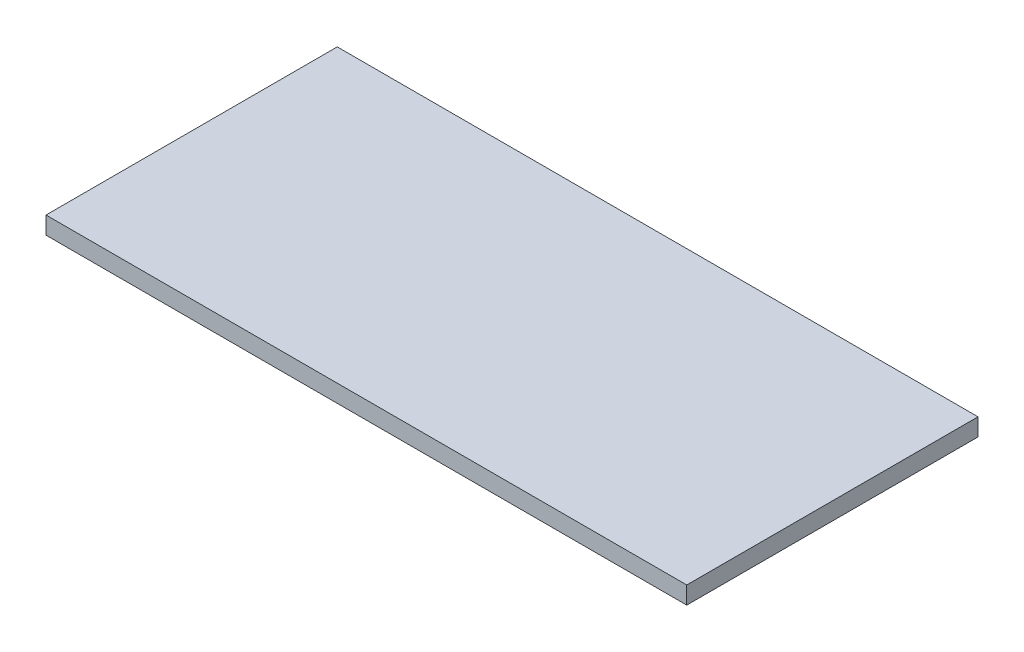
ISO-10303-21;
HEADER;
FILE_DESCRIPTION(('STEP AP214'),'2;1');
FILE_NAME('part.step','',(''),(''),'','','');
FILE_SCHEMA(('AUTOMOTIVE_DESIGN { 1 0 10303 214 1 1 1 1 }'));
ENDSEC;
DATA;
#1=APPLICATION_CONTEXT('core data for automotive mechanical design processes');
#2=APPLICATION_PROTOCOL_DEFINITION('international standard','automotive_design',2000,#1);
#3=PRODUCT_CONTEXT('',#1,'mechanical');
#4=PRODUCT('Part','Part','',(#3));
#5=PRODUCT_RELATED_PRODUCT_CATEGORY('part','',(#4));
#6=PRODUCT_DEFINITION_FORMATION('','',#4);
#7=PRODUCT_DEFINITION_CONTEXT('part definition',#1,'design');
#8=PRODUCT_DEFINITION('design','',#6,#7);
#9=PRODUCT_DEFINITION_SHAPE('','',#8);
#10=(LENGTH_UNIT() NAMED_UNIT(*) SI_UNIT(.MILLI.,.METRE.));
#11=(NAMED_UNIT(*) PLANE_ANGLE_UNIT() SI_UNIT($,.RADIAN.));
#12=(NAMED_UNIT(*) SI_UNIT($,.STERADIAN.) SOLID_ANGLE_UNIT());
#13=UNCERTAINTY_MEASURE_WITH_UNIT(LENGTH_MEASURE(1.E-05),#10,'distance_accuracy_value','');
#14=(GEOMETRIC_REPRESENTATION_CONTEXT(3) GLOBAL_UNCERTAINTY_ASSIGNED_CONTEXT((#13)) GLOBAL_UNIT_ASSIGNED_CONTEXT((#10,
#11,#12)) REPRESENTATION_CONTEXT('',''));
#15=CARTESIAN_POINT('',(0.,0.,0.));
#16=DIRECTION('',(0.,0.,1.));
#17=DIRECTION('',(1.,0.,0.));
#18=AXIS2_PLACEMENT_3D('',#15,#16,#17);
#19=CARTESIAN_POINT('',(550.,30.,250.));
#20=DIRECTION('',(-1.,0.,0.));
#21=DIRECTION('',(0.,0.,1.));
#22=AXIS2_PLACEMENT_3D('',#19,#20,#21);
#23=PLANE('',#22);
#24=DIRECTION('',(0.,0.,-1.));
#25=VECTOR('',#24,1.);
#26=CARTESIAN_POINT('',(550.,0.,250.));
#27=LINE('',#26,#25);
#28=CARTESIAN_POINT('',(550.,0.,250.));
#29=VERTEX_POINT('',#28);
#30=CARTESIAN_POINT('',(550.,0.,-250.));
#31=VERTEX_POINT('',#30);
#32=EDGE_CURVE('E80',#29,#31,#27,.T.);
#33=ORIENTED_EDGE('',*,*,#32,.T.);
#34=DIRECTION('',(0.,-1.,0.));
#35=VECTOR('',#34,1.);
#36=CARTESIAN_POINT('',(550.,30.,-250.));
#37=LINE('',#36,#35);
#38=CARTESIAN_POINT('',(550.,30.,-250.));
#39=VERTEX_POINT('',#38);
#40=EDGE_CURVE('E11',#39,#31,#37,.T.);
#41=ORIENTED_EDGE('',*,*,#40,.F.);
#42=DIRECTION('',(0.,0.,-1.));
#43=VECTOR('',#42,1.);
#44=CARTESIAN_POINT('',(550.,30.,250.));
#45=LINE('',#44,#43);
#46=CARTESIAN_POINT('',(550.,30.,250.));
#47=VERTEX_POINT('',#46);
#48=EDGE_CURVE('E68',#47,#39,#45,.T.);
#49=ORIENTED_EDGE('',*,*,#48,.F.);
#50=DIRECTION('',(0.,-1.,0.));
#51=VECTOR('',#50,1.);
#52=CARTESIAN_POINT('',(550.,30.,250.));
#53=LINE('',#52,#51);
#54=EDGE_CURVE('E76',#47,#29,#53,.T.);
#55=ORIENTED_EDGE('',*,*,#54,.T.);
#56=EDGE_LOOP('',(#33,#41,#49,#55));
#57=FACE_BOUND('',#56,.T.);
#58=ADVANCED_FACE('F17',(#57),#23,.F.);
#59=CARTESIAN_POINT('',(-550.,30.,-250.));
#60=DIRECTION('',(0.,0.,1.));
#61=DIRECTION('',(1.,0.,0.));
#62=AXIS2_PLACEMENT_3D('',#59,#60,#61);
#63=PLANE('',#62);
#64=DIRECTION('',(-1.,0.,0.));
#65=VECTOR('',#64,1.);
#66=CARTESIAN_POINT('',(-550.,0.,-250.));
#67=LINE('',#66,#65);
#68=CARTESIAN_POINT('',(-550.,0.,-250.));
#69=VERTEX_POINT('',#68);
#70=EDGE_CURVE('E72',#31,#69,#67,.T.);
#71=ORIENTED_EDGE('',*,*,#70,.T.);
#72=DIRECTION('',(0.,-1.,0.));
#73=VECTOR('',#72,1.);
#74=CARTESIAN_POINT('',(-550.,30.,-250.));
#75=LINE('',#74,#73);
#76=CARTESIAN_POINT('',(-550.,30.,-250.));
#77=VERTEX_POINT('',#76);
#78=EDGE_CURVE('E25',#77,#69,#75,.T.);
#79=ORIENTED_EDGE('',*,*,#78,.F.);
#80=DIRECTION('',(-1.,0.,0.));
#81=VECTOR('',#80,1.);
#82=CARTESIAN_POINT('',(-550.,30.,-250.));
#83=LINE('',#82,#81);
#84=EDGE_CURVE('E63',#39,#77,#83,.T.);
#85=ORIENTED_EDGE('',*,*,#84,.F.);
#86=ORIENTED_EDGE('',*,*,#40,.T.);
#87=EDGE_LOOP('',(#71,#79,#85,#86));
#88=FACE_BOUND('',#87,.T.);
#89=ADVANCED_FACE('F71',(#88),#63,.F.);
#90=CARTESIAN_POINT('',(-550.,30.,250.));
#91=DIRECTION('',(1.,0.,0.));
#92=DIRECTION('',(0.,0.,-1.));
#93=AXIS2_PLACEMENT_3D('',#90,#91,#92);
#94=PLANE('',#93);
#95=DIRECTION('',(0.,0.,1.));
#96=VECTOR('',#95,1.);
#97=CARTESIAN_POINT('',(-550.,0.,250.));
#98=LINE('',#97,#96);
#99=CARTESIAN_POINT('',(-550.,0.,250.));
#100=VERTEX_POINT('',#99);
#101=EDGE_CURVE('E50',#69,#100,#98,.T.);
#102=ORIENTED_EDGE('',*,*,#101,.T.);
#103=DIRECTION('',(0.,-1.,0.));
#104=VECTOR('',#103,1.);
#105=CARTESIAN_POINT('',(-550.,30.,250.));
#106=LINE('',#105,#104);
#107=CARTESIAN_POINT('',(-550.,30.,250.));
#108=VERTEX_POINT('',#107);
#109=EDGE_CURVE('E73',#108,#100,#106,.T.);
#110=ORIENTED_EDGE('',*,*,#109,.F.);
#111=DIRECTION('',(0.,0.,1.));
#112=VECTOR('',#111,1.);
#113=CARTESIAN_POINT('',(-550.,30.,250.));
#114=LINE('',#113,#112);
#115=EDGE_CURVE('E66',#77,#108,#114,.T.);
#116=ORIENTED_EDGE('',*,*,#115,.F.);
#117=ORIENTED_EDGE('',*,*,#78,.T.);
#118=EDGE_LOOP('',(#102,#110,#116,#117));
#119=FACE_BOUND('',#118,.T.);
#120=ADVANCED_FACE('F74',(#119),#94,.F.);
#121=CARTESIAN_POINT('',(-550.,30.,250.));
#122=DIRECTION('',(0.,0.,-1.));
#123=DIRECTION('',(-1.,0.,0.));
#124=AXIS2_PLACEMENT_3D('',#121,#122,#123);
#125=PLANE('',#124);
#126=DIRECTION('',(1.,0.,0.));
#127=VECTOR('',#126,1.);
#128=CARTESIAN_POINT('',(-550.,0.,250.));
#129=LINE('',#128,#127);
#130=EDGE_CURVE('E56',#100,#29,#129,.T.);
#131=ORIENTED_EDGE('',*,*,#130,.T.);
#132=ORIENTED_EDGE('',*,*,#54,.F.);
#133=DIRECTION('',(1.,0.,0.));
#134=VECTOR('',#133,1.);
#135=CARTESIAN_POINT('',(-550.,30.,250.));
#136=LINE('',#135,#134);
#137=EDGE_CURVE('E33',#108,#47,#136,.T.);
#138=ORIENTED_EDGE('',*,*,#137,.F.);
#139=ORIENTED_EDGE('',*,*,#109,.T.);
#140=EDGE_LOOP('',(#131,#132,#138,#139));
#141=FACE_BOUND('',#140,.T.);
#142=ADVANCED_FACE('F87',(#141),#125,.F.);
#143=CARTESIAN_POINT('',(0.,30.,0.));
#144=DIRECTION('',(0.,-1.,0.));
#145=DIRECTION('',(0.,0.,-1.));
#146=AXIS2_PLACEMENT_3D('',#143,#144,#145);
#147=PLANE('',#146);
#148=ORIENTED_EDGE('',*,*,#48,.T.);
#149=ORIENTED_EDGE('',*,*,#84,.T.);
#150=ORIENTED_EDGE('',*,*,#115,.T.);
#151=ORIENTED_EDGE('',*,*,#137,.T.);
#152=EDGE_LOOP('',(#148,#149,#150,#151));
#153=FACE_BOUND('',#152,.T.);
#154=ADVANCED_FACE('F64',(#153),#147,.F.);
#155=CARTESIAN_POINT('',(0.,0.,0.));
#156=DIRECTION('',(0.,-1.,0.));
#157=DIRECTION('',(0.,0.,-1.));
#158=AXIS2_PLACEMENT_3D('',#155,#156,#157);
#159=PLANE('',#158);
#160=ORIENTED_EDGE('',*,*,#32,.F.);
#161=ORIENTED_EDGE('',*,*,#130,.F.);
#162=ORIENTED_EDGE('',*,*,#101,.F.);
#163=ORIENTED_EDGE('',*,*,#70,.F.);
#164=EDGE_LOOP('',(#160,#161,#162,#163));
#165=FACE_BOUND('',#164,.T.);
#166=ADVANCED_FACE('F90',(#165),#159,.T.);
#167=CLOSED_SHELL('',(#58,#89,#120,#142,#154,#166));
#168=MANIFOLD_SOLID_BREP('B1',#167);
#169=ADVANCED_BREP_SHAPE_REPRESENTATION('',(#18,#168),#14);
#170=SHAPE_DEFINITION_REPRESENTATION(#9,#169);
ENDSEC;
END-ISO-10303-21;
